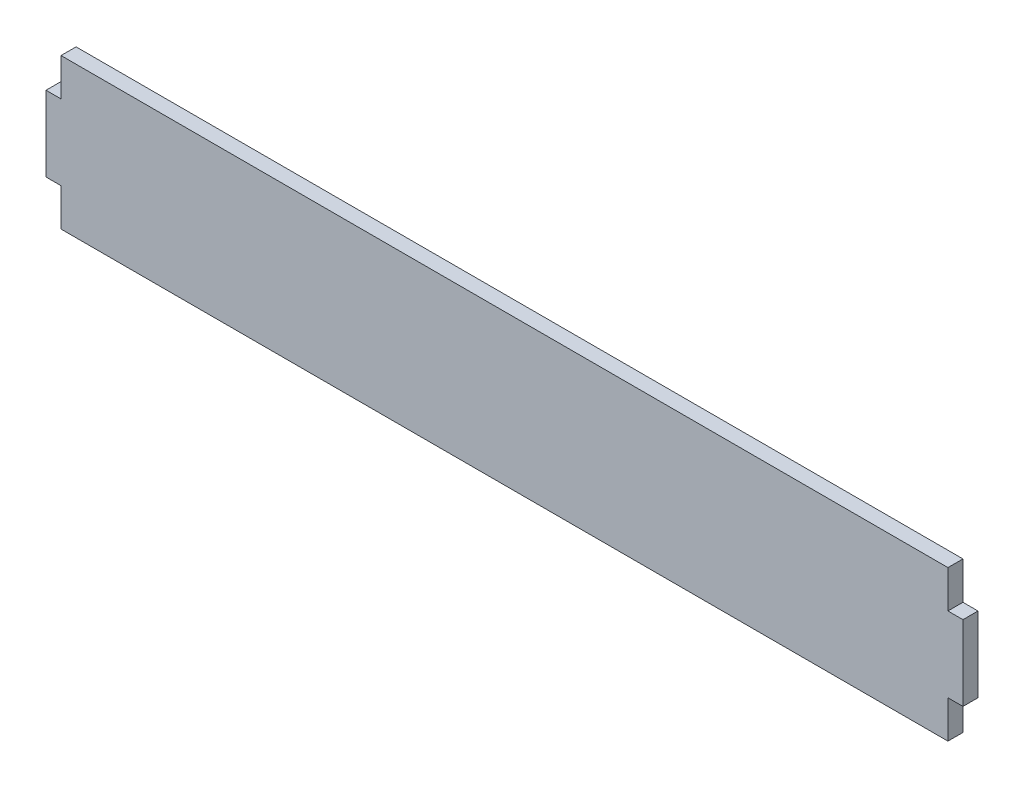
ISO-10303-21;
HEADER;
FILE_DESCRIPTION(('STEP AP214'),'2;1');
FILE_NAME('part.step','',(''),(''),'','','');
FILE_SCHEMA(('AUTOMOTIVE_DESIGN { 1 0 10303 214 1 1 1 1 }'));
ENDSEC;
DATA;
#1=APPLICATION_CONTEXT('core data for automotive mechanical design processes');
#2=APPLICATION_PROTOCOL_DEFINITION('international standard','automotive_design',2000,#1);
#3=PRODUCT_CONTEXT('',#1,'mechanical');
#4=PRODUCT('Part','Part','',(#3));
#5=PRODUCT_RELATED_PRODUCT_CATEGORY('part','',(#4));
#6=PRODUCT_DEFINITION_FORMATION('','',#4);
#7=PRODUCT_DEFINITION_CONTEXT('part definition',#1,'design');
#8=PRODUCT_DEFINITION('design','',#6,#7);
#9=PRODUCT_DEFINITION_SHAPE('','',#8);
#10=(LENGTH_UNIT() NAMED_UNIT(*) SI_UNIT(.MILLI.,.METRE.));
#11=(NAMED_UNIT(*) PLANE_ANGLE_UNIT() SI_UNIT($,.RADIAN.));
#12=(NAMED_UNIT(*) SI_UNIT($,.STERADIAN.) SOLID_ANGLE_UNIT());
#13=UNCERTAINTY_MEASURE_WITH_UNIT(LENGTH_MEASURE(1.E-05),#10,'distance_accuracy_value','');
#14=(GEOMETRIC_REPRESENTATION_CONTEXT(3) GLOBAL_UNCERTAINTY_ASSIGNED_CONTEXT((#13)) GLOBAL_UNIT_ASSIGNED_CONTEXT((#10,
#11,#12)) REPRESENTATION_CONTEXT('',''));
#15=CARTESIAN_POINT('',(0.,0.,0.));
#16=DIRECTION('',(0.,0.,1.));
#17=DIRECTION('',(1.,0.,0.));
#18=AXIS2_PLACEMENT_3D('',#15,#16,#17);
#19=CARTESIAN_POINT('',(0.,0.,5.));
#20=DIRECTION('',(0.,-1.,0.));
#21=DIRECTION('',(0.,0.,-1.));
#22=AXIS2_PLACEMENT_3D('',#19,#20,#21);
#23=PLANE('',#22);
#24=DIRECTION('',(-1.,0.,0.));
#25=VECTOR('',#24,1.);
#26=CARTESIAN_POINT('',(0.,0.,0.));
#27=LINE('',#26,#25);
#28=CARTESIAN_POINT('',(0.,0.,0.));
#29=VERTEX_POINT('',#28);
#30=CARTESIAN_POINT('',(-295.,0.,0.));
#31=VERTEX_POINT('',#30);
#32=EDGE_CURVE('E158',#29,#31,#27,.T.);
#33=ORIENTED_EDGE('',*,*,#32,.T.);
#34=DIRECTION('',(0.,0.,-1.));
#35=VECTOR('',#34,1.);
#36=CARTESIAN_POINT('',(-295.,0.,5.));
#37=LINE('',#36,#35);
#38=CARTESIAN_POINT('',(-295.,0.,5.));
#39=VERTEX_POINT('',#38);
#40=EDGE_CURVE('E12',#39,#31,#37,.T.);
#41=ORIENTED_EDGE('',*,*,#40,.F.);
#42=DIRECTION('',(-1.,0.,0.));
#43=VECTOR('',#42,1.);
#44=CARTESIAN_POINT('',(0.,0.,5.));
#45=LINE('',#44,#43);
#46=CARTESIAN_POINT('',(0.,0.,5.));
#47=VERTEX_POINT('',#46);
#48=EDGE_CURVE('E254',#47,#39,#45,.T.);
#49=ORIENTED_EDGE('',*,*,#48,.F.);
#50=DIRECTION('',(0.,0.,-1.));
#51=VECTOR('',#50,1.);
#52=CARTESIAN_POINT('',(0.,0.,5.));
#53=LINE('',#52,#51);
#54=EDGE_CURVE('E51',#47,#29,#53,.T.);
#55=ORIENTED_EDGE('',*,*,#54,.T.);
#56=EDGE_LOOP('',(#33,#41,#49,#55));
#57=FACE_BOUND('',#56,.T.);
#58=ADVANCED_FACE('F35',(#57),#23,.F.);
#59=CARTESIAN_POINT('',(-295.,0.,5.));
#60=DIRECTION('',(1.,0.,0.));
#61=DIRECTION('',(0.,0.,-1.));
#62=AXIS2_PLACEMENT_3D('',#59,#60,#61);
#63=PLANE('',#62);
#64=DIRECTION('',(0.,-1.,0.));
#65=VECTOR('',#64,1.);
#66=CARTESIAN_POINT('',(-295.,0.,0.));
#67=LINE('',#66,#65);
#68=CARTESIAN_POINT('',(-295.,-12.5,0.));
#69=VERTEX_POINT('',#68);
#70=EDGE_CURVE('E160',#31,#69,#67,.T.);
#71=ORIENTED_EDGE('',*,*,#70,.T.);
#72=DIRECTION('',(0.,0.,-1.));
#73=VECTOR('',#72,1.);
#74=CARTESIAN_POINT('',(-295.,-12.5,5.));
#75=LINE('',#74,#73);
#76=CARTESIAN_POINT('',(-295.,-12.5,5.));
#77=VERTEX_POINT('',#76);
#78=EDGE_CURVE('E43',#77,#69,#75,.T.);
#79=ORIENTED_EDGE('',*,*,#78,.F.);
#80=DIRECTION('',(0.,-1.,0.));
#81=VECTOR('',#80,1.);
#82=CARTESIAN_POINT('',(-295.,0.,5.));
#83=LINE('',#82,#81);
#84=EDGE_CURVE('E101',#39,#77,#83,.T.);
#85=ORIENTED_EDGE('',*,*,#84,.F.);
#86=ORIENTED_EDGE('',*,*,#40,.T.);
#87=EDGE_LOOP('',(#71,#79,#85,#86));
#88=FACE_BOUND('',#87,.T.);
#89=ADVANCED_FACE('F276',(#88),#63,.F.);
#90=CARTESIAN_POINT('',(0.,-12.5000000000002,5.));
#91=DIRECTION('',(0.,-1.,0.));
#92=DIRECTION('',(1.,0.,0.));
#93=AXIS2_PLACEMENT_3D('',#90,#91,#92);
#94=PLANE('',#93);
#95=DIRECTION('',(-1.,0.,0.));
#96=VECTOR('',#95,1.);
#97=CARTESIAN_POINT('',(0.,-12.5000000000002,0.));
#98=LINE('',#97,#96);
#99=CARTESIAN_POINT('',(-300.,-12.5,0.));
#100=VERTEX_POINT('',#99);
#101=EDGE_CURVE('E196',#69,#100,#98,.T.);
#102=ORIENTED_EDGE('',*,*,#101,.T.);
#103=DIRECTION('',(0.,0.,-1.));
#104=VECTOR('',#103,1.);
#105=CARTESIAN_POINT('',(-300.,-12.5,5.));
#106=LINE('',#105,#104);
#107=CARTESIAN_POINT('',(-300.,-12.5,5.));
#108=VERTEX_POINT('',#107);
#109=EDGE_CURVE('E231',#108,#100,#106,.T.);
#110=ORIENTED_EDGE('',*,*,#109,.F.);
#111=DIRECTION('',(-1.,0.,0.));
#112=VECTOR('',#111,1.);
#113=CARTESIAN_POINT('',(0.,-12.5000000000002,5.));
#114=LINE('',#113,#112);
#115=EDGE_CURVE('E234',#77,#108,#114,.T.);
#116=ORIENTED_EDGE('',*,*,#115,.F.);
#117=ORIENTED_EDGE('',*,*,#78,.T.);
#118=EDGE_LOOP('',(#102,#110,#116,#117));
#119=FACE_BOUND('',#118,.T.);
#120=ADVANCED_FACE('F233',(#119),#94,.F.);
#121=CARTESIAN_POINT('',(-300.,0.,5.));
#122=DIRECTION('',(-1.,0.,0.));
#123=DIRECTION('',(0.,0.,1.));
#124=AXIS2_PLACEMENT_3D('',#121,#122,#123);
#125=PLANE('',#124);
#126=DIRECTION('',(0.,1.,0.));
#127=VECTOR('',#126,1.);
#128=CARTESIAN_POINT('',(-300.,0.,0.));
#129=LINE('',#128,#127);
#130=CARTESIAN_POINT('',(-300.,-37.5,0.));
#131=VERTEX_POINT('',#130);
#132=EDGE_CURVE('E193',#131,#100,#129,.T.);
#133=ORIENTED_EDGE('',*,*,#132,.F.);
#134=DIRECTION('',(0.,0.,-1.));
#135=VECTOR('',#134,1.);
#136=CARTESIAN_POINT('',(-300.,-37.5,5.));
#137=LINE('',#136,#135);
#138=CARTESIAN_POINT('',(-300.,-37.5,5.));
#139=VERTEX_POINT('',#138);
#140=EDGE_CURVE('E224',#139,#131,#137,.T.);
#141=ORIENTED_EDGE('',*,*,#140,.F.);
#142=DIRECTION('',(0.,1.,0.));
#143=VECTOR('',#142,1.);
#144=CARTESIAN_POINT('',(-300.,0.,5.));
#145=LINE('',#144,#143);
#146=EDGE_CURVE('E240',#139,#108,#145,.T.);
#147=ORIENTED_EDGE('',*,*,#146,.T.);
#148=ORIENTED_EDGE('',*,*,#109,.T.);
#149=EDGE_LOOP('',(#133,#141,#147,#148));
#150=FACE_BOUND('',#149,.T.);
#151=ADVANCED_FACE('F237',(#150),#125,.T.);
#152=CARTESIAN_POINT('',(0.,-37.5,5.));
#153=DIRECTION('',(0.,-1.,0.));
#154=DIRECTION('',(0.,0.,-1.));
#155=AXIS2_PLACEMENT_3D('',#152,#153,#154);
#156=PLANE('',#155);
#157=DIRECTION('',(-1.,0.,0.));
#158=VECTOR('',#157,1.);
#159=CARTESIAN_POINT('',(0.,-37.5,0.));
#160=LINE('',#159,#158);
#161=CARTESIAN_POINT('',(-295.,-37.5,0.));
#162=VERTEX_POINT('',#161);
#163=EDGE_CURVE('E189',#162,#131,#160,.T.);
#164=ORIENTED_EDGE('',*,*,#163,.F.);
#165=DIRECTION('',(0.,0.,-1.));
#166=VECTOR('',#165,1.);
#167=CARTESIAN_POINT('',(-295.,-37.5,5.));
#168=LINE('',#167,#166);
#169=CARTESIAN_POINT('',(-295.,-37.5,5.));
#170=VERTEX_POINT('',#169);
#171=EDGE_CURVE('E222',#170,#162,#168,.T.);
#172=ORIENTED_EDGE('',*,*,#171,.F.);
#173=DIRECTION('',(-1.,0.,0.));
#174=VECTOR('',#173,1.);
#175=CARTESIAN_POINT('',(0.,-37.5,5.));
#176=LINE('',#175,#174);
#177=EDGE_CURVE('E243',#170,#139,#176,.T.);
#178=ORIENTED_EDGE('',*,*,#177,.T.);
#179=ORIENTED_EDGE('',*,*,#140,.T.);
#180=EDGE_LOOP('',(#164,#172,#178,#179));
#181=FACE_BOUND('',#180,.T.);
#182=ADVANCED_FACE('F344',(#181),#156,.T.);
#183=CARTESIAN_POINT('',(-295.,-50.,0.));
#184=VERTEX_POINT('',#183);
#185=EDGE_CURVE('E192',#162,#184,#67,.T.);
#186=ORIENTED_EDGE('',*,*,#185,.T.);
#187=DIRECTION('',(0.,0.,-1.));
#188=VECTOR('',#187,1.);
#189=CARTESIAN_POINT('',(-295.,-50.,5.));
#190=LINE('',#189,#188);
#191=CARTESIAN_POINT('',(-295.,-50.,5.));
#192=VERTEX_POINT('',#191);
#193=EDGE_CURVE('E219',#192,#184,#190,.T.);
#194=ORIENTED_EDGE('',*,*,#193,.F.);
#195=EDGE_CURVE('E245',#170,#192,#83,.T.);
#196=ORIENTED_EDGE('',*,*,#195,.F.);
#197=ORIENTED_EDGE('',*,*,#171,.T.);
#198=EDGE_LOOP('',(#186,#194,#196,#197));
#199=FACE_BOUND('',#198,.T.);
#200=ADVANCED_FACE('F281',(#199),#63,.F.);
#201=CARTESIAN_POINT('',(0.,-50.,5.));
#202=DIRECTION('',(0.,-1.,0.));
#203=DIRECTION('',(0.,0.,-1.));
#204=AXIS2_PLACEMENT_3D('',#201,#202,#203);
#205=PLANE('',#204);
#206=DIRECTION('',(-1.,0.,0.));
#207=VECTOR('',#206,1.);
#208=CARTESIAN_POINT('',(0.,-50.,0.));
#209=LINE('',#208,#207);
#210=CARTESIAN_POINT('',(0.,-50.,0.));
#211=VERTEX_POINT('',#210);
#212=EDGE_CURVE('E175',#211,#184,#209,.T.);
#213=ORIENTED_EDGE('',*,*,#212,.F.);
#214=DIRECTION('',(0.,0.,-1.));
#215=VECTOR('',#214,1.);
#216=CARTESIAN_POINT('',(0.,-50.,5.));
#217=LINE('',#216,#215);
#218=CARTESIAN_POINT('',(0.,-50.,5.));
#219=VERTEX_POINT('',#218);
#220=EDGE_CURVE('E217',#219,#211,#217,.T.);
#221=ORIENTED_EDGE('',*,*,#220,.F.);
#222=DIRECTION('',(-1.,0.,0.));
#223=VECTOR('',#222,1.);
#224=CARTESIAN_POINT('',(0.,-50.,5.));
#225=LINE('',#224,#223);
#226=EDGE_CURVE('E220',#219,#192,#225,.T.);
#227=ORIENTED_EDGE('',*,*,#226,.T.);
#228=ORIENTED_EDGE('',*,*,#193,.T.);
#229=EDGE_LOOP('',(#213,#221,#227,#228));
#230=FACE_BOUND('',#229,.T.);
#231=ADVANCED_FACE('F215',(#230),#205,.T.);
#232=CARTESIAN_POINT('',(0.,0.,5.));
#233=DIRECTION('',(1.,0.,0.));
#234=DIRECTION('',(0.,1.,0.));
#235=AXIS2_PLACEMENT_3D('',#232,#233,#234);
#236=PLANE('',#235);
#237=DIRECTION('',(0.,-1.,0.));
#238=VECTOR('',#237,1.);
#239=CARTESIAN_POINT('',(0.,0.,0.));
#240=LINE('',#239,#238);
#241=CARTESIAN_POINT('',(0.,-37.5,0.));
#242=VERTEX_POINT('',#241);
#243=EDGE_CURVE('E169',#242,#211,#240,.T.);
#244=ORIENTED_EDGE('',*,*,#243,.F.);
#245=DIRECTION('',(0.,0.,-1.));
#246=VECTOR('',#245,1.);
#247=CARTESIAN_POINT('',(0.,-37.5,5.));
#248=LINE('',#247,#246);
#249=CARTESIAN_POINT('',(0.,-37.5,5.));
#250=VERTEX_POINT('',#249);
#251=EDGE_CURVE('E226',#250,#242,#248,.T.);
#252=ORIENTED_EDGE('',*,*,#251,.F.);
#253=DIRECTION('',(0.,-1.,0.));
#254=VECTOR('',#253,1.);
#255=CARTESIAN_POINT('',(0.,0.,5.));
#256=LINE('',#255,#254);
#257=EDGE_CURVE('E155',#250,#219,#256,.T.);
#258=ORIENTED_EDGE('',*,*,#257,.T.);
#259=ORIENTED_EDGE('',*,*,#220,.T.);
#260=EDGE_LOOP('',(#244,#252,#258,#259));
#261=FACE_BOUND('',#260,.T.);
#262=ADVANCED_FACE('F252',(#261),#236,.T.);
#263=CARTESIAN_POINT('',(0.,-37.5,5.));
#264=DIRECTION('',(0.,1.,0.));
#265=DIRECTION('',(0.,0.,1.));
#266=AXIS2_PLACEMENT_3D('',#263,#264,#265);
#267=PLANE('',#266);
#268=DIRECTION('',(1.,0.,0.));
#269=VECTOR('',#268,1.);
#270=CARTESIAN_POINT('',(0.,-37.5,0.));
#271=LINE('',#270,#269);
#272=CARTESIAN_POINT('',(5.00000000000001,-37.5,0.));
#273=VERTEX_POINT('',#272);
#274=EDGE_CURVE('E174',#242,#273,#271,.T.);
#275=ORIENTED_EDGE('',*,*,#274,.T.);
#276=DIRECTION('',(0.,0.,-1.));
#277=VECTOR('',#276,1.);
#278=CARTESIAN_POINT('',(5.00000000000001,-37.5,5.));
#279=LINE('',#278,#277);
#280=CARTESIAN_POINT('',(5.00000000000001,-37.5,5.));
#281=VERTEX_POINT('',#280);
#282=EDGE_CURVE('E149',#281,#273,#279,.T.);
#283=ORIENTED_EDGE('',*,*,#282,.F.);
#284=DIRECTION('',(1.,0.,0.));
#285=VECTOR('',#284,1.);
#286=CARTESIAN_POINT('',(0.,-37.5,5.));
#287=LINE('',#286,#285);
#288=EDGE_CURVE('E137',#250,#281,#287,.T.);
#289=ORIENTED_EDGE('',*,*,#288,.F.);
#290=ORIENTED_EDGE('',*,*,#251,.T.);
#291=EDGE_LOOP('',(#275,#283,#289,#290));
#292=FACE_BOUND('',#291,.T.);
#293=ADVANCED_FACE('F264',(#292),#267,.F.);
#294=CARTESIAN_POINT('',(5.00000000000001,0.,5.));
#295=DIRECTION('',(-1.,0.,0.));
#296=DIRECTION('',(0.,0.,1.));
#297=AXIS2_PLACEMENT_3D('',#294,#295,#296);
#298=PLANE('',#297);
#299=DIRECTION('',(0.,1.,0.));
#300=VECTOR('',#299,1.);
#301=CARTESIAN_POINT('',(5.00000000000001,0.,0.));
#302=LINE('',#301,#300);
#303=CARTESIAN_POINT('',(5.00000000000001,-12.5,0.));
#304=VERTEX_POINT('',#303);
#305=EDGE_CURVE('E146',#273,#304,#302,.T.);
#306=ORIENTED_EDGE('',*,*,#305,.T.);
#307=DIRECTION('',(0.,0.,-1.));
#308=VECTOR('',#307,1.);
#309=CARTESIAN_POINT('',(5.00000000000001,-12.5,5.));
#310=LINE('',#309,#308);
#311=CARTESIAN_POINT('',(5.00000000000001,-12.5,5.));
#312=VERTEX_POINT('',#311);
#313=EDGE_CURVE('E143',#312,#304,#310,.T.);
#314=ORIENTED_EDGE('',*,*,#313,.F.);
#315=DIRECTION('',(0.,1.,0.));
#316=VECTOR('',#315,1.);
#317=CARTESIAN_POINT('',(5.00000000000001,0.,5.));
#318=LINE('',#317,#316);
#319=EDGE_CURVE('E129',#281,#312,#318,.T.);
#320=ORIENTED_EDGE('',*,*,#319,.F.);
#321=ORIENTED_EDGE('',*,*,#282,.T.);
#322=EDGE_LOOP('',(#306,#314,#320,#321));
#323=FACE_BOUND('',#322,.T.);
#324=ADVANCED_FACE('F144',(#323),#298,.F.);
#325=CARTESIAN_POINT('',(0.,-12.5,5.));
#326=DIRECTION('',(0.,1.,0.));
#327=DIRECTION('',(0.,0.,1.));
#328=AXIS2_PLACEMENT_3D('',#325,#326,#327);
#329=PLANE('',#328);
#330=DIRECTION('',(1.,0.,0.));
#331=VECTOR('',#330,1.);
#332=CARTESIAN_POINT('',(0.,-12.5,0.));
#333=LINE('',#332,#331);
#334=CARTESIAN_POINT('',(0.,-12.5,0.));
#335=VERTEX_POINT('',#334);
#336=EDGE_CURVE('E257',#335,#304,#333,.T.);
#337=ORIENTED_EDGE('',*,*,#336,.F.);
#338=DIRECTION('',(0.,0.,-1.));
#339=VECTOR('',#338,1.);
#340=CARTESIAN_POINT('',(0.,-12.5,5.));
#341=LINE('',#340,#339);
#342=CARTESIAN_POINT('',(0.,-12.5,5.));
#343=VERTEX_POINT('',#342);
#344=EDGE_CURVE('E89',#343,#335,#341,.T.);
#345=ORIENTED_EDGE('',*,*,#344,.F.);
#346=DIRECTION('',(1.,0.,0.));
#347=VECTOR('',#346,1.);
#348=CARTESIAN_POINT('',(0.,-12.5,5.));
#349=LINE('',#348,#347);
#350=EDGE_CURVE('E134',#343,#312,#349,.T.);
#351=ORIENTED_EDGE('',*,*,#350,.T.);
#352=ORIENTED_EDGE('',*,*,#313,.T.);
#353=EDGE_LOOP('',(#337,#345,#351,#352));
#354=FACE_BOUND('',#353,.T.);
#355=ADVANCED_FACE('F151',(#354),#329,.T.);
#356=EDGE_CURVE('E176',#29,#335,#240,.T.);
#357=ORIENTED_EDGE('',*,*,#356,.F.);
#358=ORIENTED_EDGE('',*,*,#54,.F.);
#359=EDGE_CURVE('E152',#47,#343,#256,.T.);
#360=ORIENTED_EDGE('',*,*,#359,.T.);
#361=ORIENTED_EDGE('',*,*,#344,.T.);
#362=EDGE_LOOP('',(#357,#358,#360,#361));
#363=FACE_BOUND('',#362,.T.);
#364=ADVANCED_FACE('F273',(#363),#236,.T.);
#365=CARTESIAN_POINT('',(0.,0.,5.));
#366=DIRECTION('',(0.,0.,1.));
#367=DIRECTION('',(1.,0.,0.));
#368=AXIS2_PLACEMENT_3D('',#365,#366,#367);
#369=PLANE('',#368);
#370=ORIENTED_EDGE('',*,*,#48,.T.);
#371=ORIENTED_EDGE('',*,*,#84,.T.);
#372=ORIENTED_EDGE('',*,*,#115,.T.);
#373=ORIENTED_EDGE('',*,*,#146,.F.);
#374=ORIENTED_EDGE('',*,*,#177,.F.);
#375=ORIENTED_EDGE('',*,*,#195,.T.);
#376=ORIENTED_EDGE('',*,*,#226,.F.);
#377=ORIENTED_EDGE('',*,*,#257,.F.);
#378=ORIENTED_EDGE('',*,*,#288,.T.);
#379=ORIENTED_EDGE('',*,*,#319,.T.);
#380=ORIENTED_EDGE('',*,*,#350,.F.);
#381=ORIENTED_EDGE('',*,*,#359,.F.);
#382=EDGE_LOOP('',(#370,#371,#372,#373,#374,#375,#376,#377,#378,#379,#380,#381));
#383=FACE_BOUND('',#382,.T.);
#384=ADVANCED_FACE('F131',(#383),#369,.T.);
#385=CARTESIAN_POINT('',(0.,0.,0.));
#386=DIRECTION('',(0.,0.,1.));
#387=DIRECTION('',(1.,0.,0.));
#388=AXIS2_PLACEMENT_3D('',#385,#386,#387);
#389=PLANE('',#388);
#390=ORIENTED_EDGE('',*,*,#32,.F.);
#391=ORIENTED_EDGE('',*,*,#356,.T.);
#392=ORIENTED_EDGE('',*,*,#336,.T.);
#393=ORIENTED_EDGE('',*,*,#305,.F.);
#394=ORIENTED_EDGE('',*,*,#274,.F.);
#395=ORIENTED_EDGE('',*,*,#243,.T.);
#396=ORIENTED_EDGE('',*,*,#212,.T.);
#397=ORIENTED_EDGE('',*,*,#185,.F.);
#398=ORIENTED_EDGE('',*,*,#163,.T.);
#399=ORIENTED_EDGE('',*,*,#132,.T.);
#400=ORIENTED_EDGE('',*,*,#101,.F.);
#401=ORIENTED_EDGE('',*,*,#70,.F.);
#402=EDGE_LOOP('',(#390,#391,#392,#393,#394,#395,#396,#397,#398,#399,#400,#401));
#403=FACE_BOUND('',#402,.T.);
#404=ADVANCED_FACE('F210',(#403),#389,.F.);
#405=CLOSED_SHELL('',(#58,#89,#120,#151,#182,#200,#231,#262,#293,#324,#355,#364,#384,#404));
#406=MANIFOLD_SOLID_BREP('B2',#405);
#407=ADVANCED_BREP_SHAPE_REPRESENTATION('',(#18,#406),#14);
#408=SHAPE_DEFINITION_REPRESENTATION(#9,#407);
ENDSEC;
END-ISO-10303-21;
